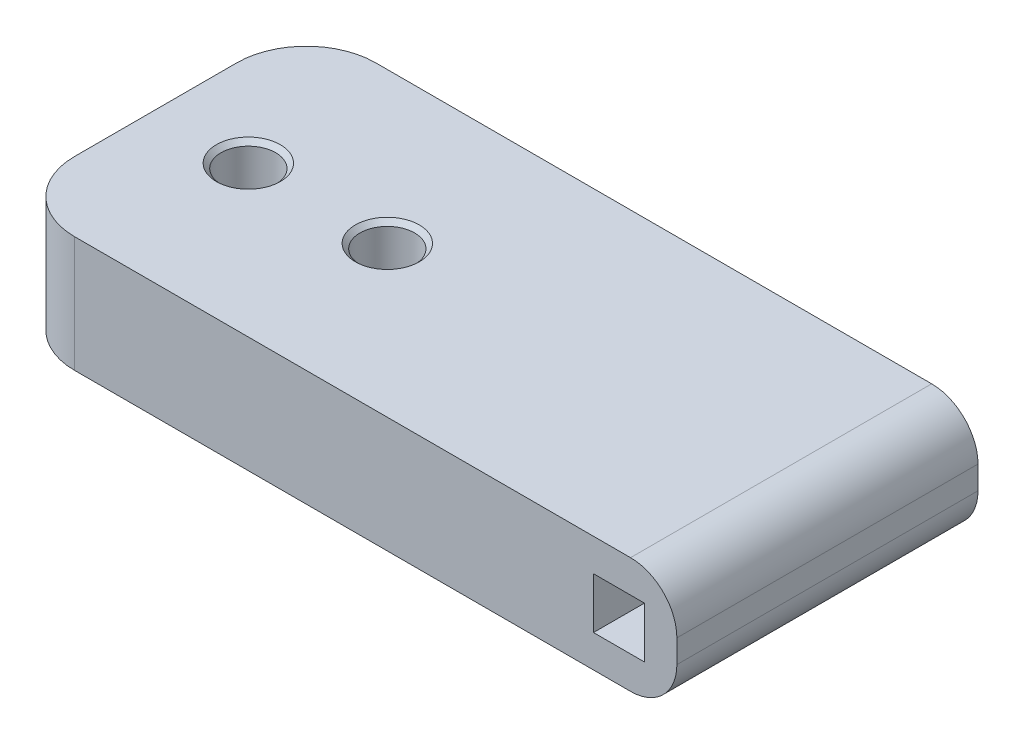
ISO-10303-21;
HEADER;
FILE_DESCRIPTION(('STEP AP214'),'2;1');
FILE_NAME('part.step','',(''),(''),'','','');
FILE_SCHEMA(('AUTOMOTIVE_DESIGN { 1 0 10303 214 1 1 1 1 }'));
ENDSEC;
DATA;
#1=APPLICATION_CONTEXT('core data for automotive mechanical design processes');
#2=APPLICATION_PROTOCOL_DEFINITION('international standard','automotive_design',2000,#1);
#3=PRODUCT_CONTEXT('',#1,'mechanical');
#4=PRODUCT('Part','Part','',(#3));
#5=PRODUCT_RELATED_PRODUCT_CATEGORY('part','',(#4));
#6=PRODUCT_DEFINITION_FORMATION('','',#4);
#7=PRODUCT_DEFINITION_CONTEXT('part definition',#1,'design');
#8=PRODUCT_DEFINITION('design','',#6,#7);
#9=PRODUCT_DEFINITION_SHAPE('','',#8);
#10=(LENGTH_UNIT() NAMED_UNIT(*) SI_UNIT(.MILLI.,.METRE.));
#11=(NAMED_UNIT(*) PLANE_ANGLE_UNIT() SI_UNIT($,.RADIAN.));
#12=(NAMED_UNIT(*) SI_UNIT($,.STERADIAN.) SOLID_ANGLE_UNIT());
#13=UNCERTAINTY_MEASURE_WITH_UNIT(LENGTH_MEASURE(1.E-05),#10,'distance_accuracy_value','');
#14=(GEOMETRIC_REPRESENTATION_CONTEXT(3) GLOBAL_UNCERTAINTY_ASSIGNED_CONTEXT((#13)) GLOBAL_UNIT_ASSIGNED_CONTEXT((#10,
#11,#12)) REPRESENTATION_CONTEXT('',''));
#15=CARTESIAN_POINT('',(0.,0.,0.));
#16=DIRECTION('',(0.,0.,1.));
#17=DIRECTION('',(1.,0.,0.));
#18=AXIS2_PLACEMENT_3D('',#15,#16,#17);
#19=CARTESIAN_POINT('',(0.,6.35,0.));
#20=DIRECTION('',(1.,0.,0.));
#21=DIRECTION('',(0.,0.,-1.));
#22=AXIS2_PLACEMENT_3D('',#19,#20,#21);
#23=PLANE('',#22);
#24=DIRECTION('',(0.,0.,1.));
#25=VECTOR('',#24,1.);
#26=CARTESIAN_POINT('',(0.,0.,0.));
#27=LINE('',#26,#25);
#28=CARTESIAN_POINT('',(0.,0.,-12.7));
#29=VERTEX_POINT('',#28);
#30=CARTESIAN_POINT('',(0.,0.,-3.81));
#31=VERTEX_POINT('',#30);
#32=EDGE_CURVE('E218',#29,#31,#27,.T.);
#33=ORIENTED_EDGE('',*,*,#32,.T.);
#34=DIRECTION('',(0.,-1.,0.));
#35=VECTOR('',#34,1.);
#36=CARTESIAN_POINT('',(0.,6.35,-3.81));
#37=LINE('',#36,#35);
#38=CARTESIAN_POINT('',(0.,6.35,-3.81));
#39=VERTEX_POINT('',#38);
#40=EDGE_CURVE('E279',#31,#39,#37,.F.);
#41=ORIENTED_EDGE('',*,*,#40,.T.);
#42=DIRECTION('',(0.,0.,1.));
#43=VECTOR('',#42,1.);
#44=CARTESIAN_POINT('',(0.,6.35,0.));
#45=LINE('',#44,#43);
#46=CARTESIAN_POINT('',(0.,6.35,-12.7));
#47=VERTEX_POINT('',#46);
#48=EDGE_CURVE('E225',#47,#39,#45,.T.);
#49=ORIENTED_EDGE('',*,*,#48,.F.);
#50=DIRECTION('',(0.,-1.,0.));
#51=VECTOR('',#50,1.);
#52=CARTESIAN_POINT('',(0.,6.35,-12.7));
#53=LINE('',#52,#51);
#54=EDGE_CURVE('E276',#47,#29,#53,.T.);
#55=ORIENTED_EDGE('',*,*,#54,.T.);
#56=EDGE_LOOP('',(#33,#41,#49,#55));
#57=FACE_BOUND('',#56,.T.);
#58=ADVANCED_FACE('F33',(#57),#23,.F.);
#59=CARTESIAN_POINT('',(0.,6.35,0.));
#60=DIRECTION('',(0.,0.,-1.));
#61=DIRECTION('',(-1.,0.,0.));
#62=AXIS2_PLACEMENT_3D('',#59,#60,#61);
#63=PLANE('',#62);
#64=DIRECTION('',(1.,0.,0.));
#65=VECTOR('',#64,1.);
#66=CARTESIAN_POINT('',(32.258,1.778,0.));
#67=LINE('',#66,#65);
#68=CARTESIAN_POINT('',(32.258,1.778,0.));
#69=VERTEX_POINT('',#68);
#70=CARTESIAN_POINT('',(35.052,1.778,0.));
#71=VERTEX_POINT('',#70);
#72=EDGE_CURVE('E208',#69,#71,#67,.T.);
#73=ORIENTED_EDGE('',*,*,#72,.F.);
#74=DIRECTION('',(0.,-1.,0.));
#75=VECTOR('',#74,1.);
#76=CARTESIAN_POINT('',(32.258,4.572,0.));
#77=LINE('',#76,#75);
#78=CARTESIAN_POINT('',(32.258,4.572,0.));
#79=VERTEX_POINT('',#78);
#80=EDGE_CURVE('E189',#79,#69,#77,.T.);
#81=ORIENTED_EDGE('',*,*,#80,.F.);
#82=DIRECTION('',(-1.,0.,0.));
#83=VECTOR('',#82,1.);
#84=CARTESIAN_POINT('',(32.258,4.572,0.));
#85=LINE('',#84,#83);
#86=CARTESIAN_POINT('',(35.052,4.572,0.));
#87=VERTEX_POINT('',#86);
#88=EDGE_CURVE('E197',#87,#79,#85,.T.);
#89=ORIENTED_EDGE('',*,*,#88,.F.);
#90=DIRECTION('',(0.,1.,0.));
#91=VECTOR('',#90,1.);
#92=CARTESIAN_POINT('',(35.052,4.572,0.));
#93=LINE('',#92,#91);
#94=EDGE_CURVE('E211',#71,#87,#93,.T.);
#95=ORIENTED_EDGE('',*,*,#94,.F.);
#96=EDGE_LOOP('',(#73,#81,#89,#95));
#97=FACE_BOUND('',#96,.T.);
#98=DIRECTION('',(1.,0.,0.));
#99=VECTOR('',#98,1.);
#100=CARTESIAN_POINT('',(0.,0.,0.));
#101=LINE('',#100,#99);
#102=CARTESIAN_POINT('',(3.81,0.,0.));
#103=VERTEX_POINT('',#102);
#104=CARTESIAN_POINT('',(34.29,0.,0.));
#105=VERTEX_POINT('',#104);
#106=EDGE_CURVE('E236',#103,#105,#101,.T.);
#107=ORIENTED_EDGE('',*,*,#106,.T.);
#108=CARTESIAN_POINT('',(34.29,2.54,0.));
#109=DIRECTION('',(0.,0.,-1.));
#110=DIRECTION('',(-1.,0.,0.));
#111=AXIS2_PLACEMENT_3D('',#108,#109,#110);
#112=CIRCLE('',#111,2.54);
#113=CARTESIAN_POINT('',(36.83,2.54,0.));
#114=VERTEX_POINT('',#113);
#115=EDGE_CURVE('E41',#105,#114,#112,.F.);
#116=ORIENTED_EDGE('',*,*,#115,.T.);
#117=DIRECTION('',(0.,-1.,0.));
#118=VECTOR('',#117,1.);
#119=CARTESIAN_POINT('',(36.83,6.35,0.));
#120=LINE('',#119,#118);
#121=CARTESIAN_POINT('',(36.83,3.81,0.));
#122=VERTEX_POINT('',#121);
#123=EDGE_CURVE('E241',#122,#114,#120,.T.);
#124=ORIENTED_EDGE('',*,*,#123,.F.);
#125=CARTESIAN_POINT('',(34.29,3.81,0.));
#126=DIRECTION('',(0.,0.,-1.));
#127=DIRECTION('',(-1.,0.,0.));
#128=AXIS2_PLACEMENT_3D('',#125,#126,#127);
#129=CIRCLE('',#128,2.54);
#130=CARTESIAN_POINT('',(34.29,6.35,0.));
#131=VERTEX_POINT('',#130);
#132=EDGE_CURVE('E48',#122,#131,#129,.F.);
#133=ORIENTED_EDGE('',*,*,#132,.T.);
#134=DIRECTION('',(1.,0.,0.));
#135=VECTOR('',#134,1.);
#136=CARTESIAN_POINT('',(0.,6.35,0.));
#137=LINE('',#136,#135);
#138=CARTESIAN_POINT('',(3.81,6.35,0.));
#139=VERTEX_POINT('',#138);
#140=EDGE_CURVE('E228',#139,#131,#137,.T.);
#141=ORIENTED_EDGE('',*,*,#140,.F.);
#142=DIRECTION('',(0.,-1.,0.));
#143=VECTOR('',#142,1.);
#144=CARTESIAN_POINT('',(3.81,6.35,0.));
#145=LINE('',#144,#143);
#146=EDGE_CURVE('E268',#139,#103,#145,.T.);
#147=ORIENTED_EDGE('',*,*,#146,.T.);
#148=EDGE_LOOP('',(#107,#116,#124,#133,#141,#147));
#149=FACE_BOUND('',#148,.T.);
#150=ADVANCED_FACE('F299',(#97,#149),#63,.F.);
#151=CARTESIAN_POINT('',(36.83,6.35,0.));
#152=DIRECTION('',(-1.,0.,0.));
#153=DIRECTION('',(0.,0.,1.));
#154=AXIS2_PLACEMENT_3D('',#151,#152,#153);
#155=PLANE('',#154);
#156=ORIENTED_EDGE('',*,*,#123,.T.);
#157=DIRECTION('',(0.,0.,-1.));
#158=VECTOR('',#157,1.);
#159=CARTESIAN_POINT('',(36.83,2.54,-16.51));
#160=LINE('',#159,#158);
#161=CARTESIAN_POINT('',(36.83,2.54,-16.51));
#162=VERTEX_POINT('',#161);
#163=EDGE_CURVE('E290',#114,#162,#160,.T.);
#164=ORIENTED_EDGE('',*,*,#163,.T.);
#165=DIRECTION('',(0.,-1.,0.));
#166=VECTOR('',#165,1.);
#167=CARTESIAN_POINT('',(36.83,6.35,-16.51));
#168=LINE('',#167,#166);
#169=CARTESIAN_POINT('',(36.83,3.81,-16.51));
#170=VERTEX_POINT('',#169);
#171=EDGE_CURVE('E233',#170,#162,#168,.T.);
#172=ORIENTED_EDGE('',*,*,#171,.F.);
#173=DIRECTION('',(0.,0.,-1.));
#174=VECTOR('',#173,1.);
#175=CARTESIAN_POINT('',(36.83,3.81,0.));
#176=LINE('',#175,#174);
#177=EDGE_CURVE('E288',#170,#122,#176,.F.);
#178=ORIENTED_EDGE('',*,*,#177,.T.);
#179=EDGE_LOOP('',(#156,#164,#172,#178));
#180=FACE_BOUND('',#179,.T.);
#181=ADVANCED_FACE('F303',(#180),#155,.F.);
#182=CARTESIAN_POINT('',(0.,6.35,-16.51));
#183=DIRECTION('',(0.,0.,1.));
#184=DIRECTION('',(1.,0.,0.));
#185=AXIS2_PLACEMENT_3D('',#182,#183,#184);
#186=PLANE('',#185);
#187=DIRECTION('',(-1.,0.,0.));
#188=VECTOR('',#187,1.);
#189=CARTESIAN_POINT('',(35.052,1.778,-16.51));
#190=LINE('',#189,#188);
#191=CARTESIAN_POINT('',(35.052,1.778,-16.51));
#192=VERTEX_POINT('',#191);
#193=CARTESIAN_POINT('',(32.258,1.778,-16.51));
#194=VERTEX_POINT('',#193);
#195=EDGE_CURVE('E183',#192,#194,#190,.T.);
#196=ORIENTED_EDGE('',*,*,#195,.F.);
#197=DIRECTION('',(0.,-1.,0.));
#198=VECTOR('',#197,1.);
#199=CARTESIAN_POINT('',(35.052,1.778,-16.51));
#200=LINE('',#199,#198);
#201=CARTESIAN_POINT('',(35.052,4.572,-16.51));
#202=VERTEX_POINT('',#201);
#203=EDGE_CURVE('E157',#202,#192,#200,.T.);
#204=ORIENTED_EDGE('',*,*,#203,.F.);
#205=DIRECTION('',(1.,0.,0.));
#206=VECTOR('',#205,1.);
#207=CARTESIAN_POINT('',(35.052,4.572,-16.51));
#208=LINE('',#207,#206);
#209=CARTESIAN_POINT('',(32.258,4.572,-16.51));
#210=VERTEX_POINT('',#209);
#211=EDGE_CURVE('E174',#210,#202,#208,.T.);
#212=ORIENTED_EDGE('',*,*,#211,.F.);
#213=DIRECTION('',(0.,1.,0.));
#214=VECTOR('',#213,1.);
#215=CARTESIAN_POINT('',(32.258,1.778,-16.51));
#216=LINE('',#215,#214);
#217=EDGE_CURVE('E177',#194,#210,#216,.T.);
#218=ORIENTED_EDGE('',*,*,#217,.F.);
#219=EDGE_LOOP('',(#196,#204,#212,#218));
#220=FACE_BOUND('',#219,.T.);
#221=ORIENTED_EDGE('',*,*,#171,.T.);
#222=CARTESIAN_POINT('',(34.29,2.54,-16.51));
#223=DIRECTION('',(0.,0.,1.));
#224=DIRECTION('',(1.,0.,0.));
#225=AXIS2_PLACEMENT_3D('',#222,#223,#224);
#226=CIRCLE('',#225,2.54);
#227=CARTESIAN_POINT('',(34.29,0.,-16.51));
#228=VERTEX_POINT('',#227);
#229=EDGE_CURVE('E295',#162,#228,#226,.F.);
#230=ORIENTED_EDGE('',*,*,#229,.T.);
#231=DIRECTION('',(-1.,0.,0.));
#232=VECTOR('',#231,1.);
#233=CARTESIAN_POINT('',(0.,0.,-16.51));
#234=LINE('',#233,#232);
#235=CARTESIAN_POINT('',(3.81,0.,-16.51));
#236=VERTEX_POINT('',#235);
#237=EDGE_CURVE('E229',#228,#236,#234,.T.);
#238=ORIENTED_EDGE('',*,*,#237,.T.);
#239=DIRECTION('',(0.,-1.,0.));
#240=VECTOR('',#239,1.);
#241=CARTESIAN_POINT('',(3.81,6.35,-16.51));
#242=LINE('',#241,#240);
#243=CARTESIAN_POINT('',(3.81,6.35,-16.51));
#244=VERTEX_POINT('',#243);
#245=EDGE_CURVE('E285',#236,#244,#242,.F.);
#246=ORIENTED_EDGE('',*,*,#245,.T.);
#247=DIRECTION('',(-1.,0.,0.));
#248=VECTOR('',#247,1.);
#249=CARTESIAN_POINT('',(0.,6.35,-16.51));
#250=LINE('',#249,#248);
#251=CARTESIAN_POINT('',(34.29,6.35,-16.51));
#252=VERTEX_POINT('',#251);
#253=EDGE_CURVE('E231',#252,#244,#250,.T.);
#254=ORIENTED_EDGE('',*,*,#253,.F.);
#255=CARTESIAN_POINT('',(34.29,3.81,-16.51));
#256=DIRECTION('',(0.,0.,1.));
#257=DIRECTION('',(1.,0.,0.));
#258=AXIS2_PLACEMENT_3D('',#255,#256,#257);
#259=CIRCLE('',#258,2.54);
#260=EDGE_CURVE('E293',#252,#170,#259,.F.);
#261=ORIENTED_EDGE('',*,*,#260,.T.);
#262=EDGE_LOOP('',(#221,#230,#238,#246,#254,#261));
#263=FACE_BOUND('',#262,.T.);
#264=ADVANCED_FACE('F308',(#220,#263),#186,.F.);
#265=CARTESIAN_POINT('',(0.,6.35,0.));
#266=DIRECTION('',(0.,-1.,0.));
#267=DIRECTION('',(0.,0.,-1.));
#268=AXIS2_PLACEMENT_3D('',#265,#266,#267);
#269=PLANE('',#268);
#270=CARTESIAN_POINT('',(12.7,6.35,-8.255));
#271=DIRECTION('',(0.,-1.,0.));
#272=DIRECTION('',(0.,0.,-1.));
#273=AXIS2_PLACEMENT_3D('',#270,#271,#272);
#274=CIRCLE('',#273,1.754);
#275=CARTESIAN_POINT('',(12.7,6.35,-10.009));
#276=VERTEX_POINT('',#275);
#277=EDGE_CURVE('E265',#276,#276,#274,.T.);
#278=ORIENTED_EDGE('',*,*,#277,.T.);
#279=EDGE_LOOP('',(#278));
#280=FACE_BOUND('',#279,.T.);
#281=CARTESIAN_POINT('',(5.08,6.35,-8.255));
#282=DIRECTION('',(0.,-1.,0.));
#283=DIRECTION('',(0.,0.,-1.));
#284=AXIS2_PLACEMENT_3D('',#281,#282,#283);
#285=CIRCLE('',#284,1.75399999999999);
#286=CARTESIAN_POINT('',(5.08,6.35,-10.009));
#287=VERTEX_POINT('',#286);
#288=EDGE_CURVE('E262',#287,#287,#285,.T.);
#289=ORIENTED_EDGE('',*,*,#288,.T.);
#290=EDGE_LOOP('',(#289));
#291=FACE_BOUND('',#290,.T.);
#292=ORIENTED_EDGE('',*,*,#140,.T.);
#293=DIRECTION('',(0.,0.,-1.));
#294=VECTOR('',#293,1.);
#295=CARTESIAN_POINT('',(34.29,6.35,0.));
#296=LINE('',#295,#294);
#297=EDGE_CURVE('E11',#131,#252,#296,.T.);
#298=ORIENTED_EDGE('',*,*,#297,.T.);
#299=ORIENTED_EDGE('',*,*,#253,.T.);
#300=CARTESIAN_POINT('',(3.81,6.35,-12.7));
#301=DIRECTION('',(0.,-1.,0.));
#302=DIRECTION('',(0.,0.,-1.));
#303=AXIS2_PLACEMENT_3D('',#300,#301,#302);
#304=CIRCLE('',#303,3.81);
#305=EDGE_CURVE('E281',#244,#47,#304,.F.);
#306=ORIENTED_EDGE('',*,*,#305,.T.);
#307=ORIENTED_EDGE('',*,*,#48,.T.);
#308=CARTESIAN_POINT('',(3.81,6.35,-3.81));
#309=DIRECTION('',(0.,-1.,0.));
#310=DIRECTION('',(0.,0.,-1.));
#311=AXIS2_PLACEMENT_3D('',#308,#309,#310);
#312=CIRCLE('',#311,3.81);
#313=EDGE_CURVE('E283',#39,#139,#312,.F.);
#314=ORIENTED_EDGE('',*,*,#313,.T.);
#315=EDGE_LOOP('',(#292,#298,#299,#306,#307,#314));
#316=FACE_BOUND('',#315,.T.);
#317=ADVANCED_FACE('F318',(#280,#291,#316),#269,.F.);
#318=CARTESIAN_POINT('',(0.,0.,0.));
#319=DIRECTION('',(0.,-1.,0.));
#320=DIRECTION('',(0.,0.,-1.));
#321=AXIS2_PLACEMENT_3D('',#318,#319,#320);
#322=PLANE('',#321);
#323=CARTESIAN_POINT('',(5.08,0.,-8.255));
#324=DIRECTION('',(0.,-1.,0.));
#325=DIRECTION('',(0.,0.,-1.));
#326=AXIS2_PLACEMENT_3D('',#323,#324,#325);
#327=CIRCLE('',#326,1.754);
#328=CARTESIAN_POINT('',(5.08,0.,-10.009));
#329=VERTEX_POINT('',#328);
#330=EDGE_CURVE('E247',#329,#329,#327,.F.);
#331=ORIENTED_EDGE('',*,*,#330,.T.);
#332=EDGE_LOOP('',(#331));
#333=FACE_BOUND('',#332,.T.);
#334=CARTESIAN_POINT('',(12.7,0.,-8.255));
#335=DIRECTION('',(0.,-1.,0.));
#336=DIRECTION('',(0.,0.,-1.));
#337=AXIS2_PLACEMENT_3D('',#334,#335,#336);
#338=CIRCLE('',#337,1.754);
#339=CARTESIAN_POINT('',(12.7,0.,-10.009));
#340=VERTEX_POINT('',#339);
#341=EDGE_CURVE('E244',#340,#340,#338,.F.);
#342=ORIENTED_EDGE('',*,*,#341,.T.);
#343=EDGE_LOOP('',(#342));
#344=FACE_BOUND('',#343,.T.);
#345=ORIENTED_EDGE('',*,*,#237,.F.);
#346=DIRECTION('',(0.,0.,-1.));
#347=VECTOR('',#346,1.);
#348=CARTESIAN_POINT('',(34.29,0.,0.));
#349=LINE('',#348,#347);
#350=EDGE_CURVE('E56',#228,#105,#349,.F.);
#351=ORIENTED_EDGE('',*,*,#350,.T.);
#352=ORIENTED_EDGE('',*,*,#106,.F.);
#353=CARTESIAN_POINT('',(3.81,0.,-3.81));
#354=DIRECTION('',(0.,-1.,0.));
#355=DIRECTION('',(0.,0.,-1.));
#356=AXIS2_PLACEMENT_3D('',#353,#354,#355);
#357=CIRCLE('',#356,3.81);
#358=EDGE_CURVE('E274',#103,#31,#357,.T.);
#359=ORIENTED_EDGE('',*,*,#358,.T.);
#360=ORIENTED_EDGE('',*,*,#32,.F.);
#361=CARTESIAN_POINT('',(3.81,0.,-12.7));
#362=DIRECTION('',(0.,-1.,0.));
#363=DIRECTION('',(0.,0.,-1.));
#364=AXIS2_PLACEMENT_3D('',#361,#362,#363);
#365=CIRCLE('',#364,3.81);
#366=EDGE_CURVE('E271',#29,#236,#365,.T.);
#367=ORIENTED_EDGE('',*,*,#366,.T.);
#368=EDGE_LOOP('',(#345,#351,#352,#359,#360,#367));
#369=FACE_BOUND('',#368,.T.);
#370=ADVANCED_FACE('F309',(#333,#344,#369),#322,.T.);
#371=CARTESIAN_POINT('',(12.7,6.35,-8.255));
#372=DIRECTION('',(0.,1.,0.));
#373=DIRECTION('',(0.,0.,1.));
#374=AXIS2_PLACEMENT_3D('',#371,#372,#373);
#375=CYLINDRICAL_SURFACE('',#374,1.49999999999999);
#376=CARTESIAN_POINT('',(12.7,0.254000000000004,-8.255));
#377=DIRECTION('',(0.,-1.,0.));
#378=DIRECTION('',(0.,0.,-1.));
#379=AXIS2_PLACEMENT_3D('',#376,#377,#378);
#380=CIRCLE('',#379,1.49999999999999);
#381=CARTESIAN_POINT('',(12.7,0.254000000000004,-9.75499999999999));
#382=VERTEX_POINT('',#381);
#383=EDGE_CURVE('E259',#382,#382,#380,.T.);
#384=ORIENTED_EDGE('',*,*,#383,.T.);
#385=EDGE_LOOP('',(#384));
#386=FACE_BOUND('',#385,.T.);
#387=CARTESIAN_POINT('',(12.7,6.096,-8.255));
#388=DIRECTION('',(0.,-1.,0.));
#389=DIRECTION('',(0.,0.,-1.));
#390=AXIS2_PLACEMENT_3D('',#387,#388,#389);
#391=CIRCLE('',#390,1.49999999999999);
#392=CARTESIAN_POINT('',(12.7,6.096,-9.75499999999999));
#393=VERTEX_POINT('',#392);
#394=EDGE_CURVE('E256',#393,#393,#391,.F.);
#395=ORIENTED_EDGE('',*,*,#394,.T.);
#396=EDGE_LOOP('',(#395));
#397=FACE_BOUND('',#396,.T.);
#398=ADVANCED_FACE('F377',(#386,#397),#375,.F.);
#399=CARTESIAN_POINT('',(5.08,6.35,-8.255));
#400=DIRECTION('',(0.,1.,0.));
#401=DIRECTION('',(0.,0.,1.));
#402=AXIS2_PLACEMENT_3D('',#399,#400,#401);
#403=CYLINDRICAL_SURFACE('',#402,1.49999999999999);
#404=CARTESIAN_POINT('',(5.08,0.254000000000004,-8.255));
#405=DIRECTION('',(0.,-1.,0.));
#406=DIRECTION('',(0.,0.,-1.));
#407=AXIS2_PLACEMENT_3D('',#404,#405,#406);
#408=CIRCLE('',#407,1.49999999999999);
#409=CARTESIAN_POINT('',(5.08,0.254000000000004,-9.75499999999999));
#410=VERTEX_POINT('',#409);
#411=EDGE_CURVE('E253',#410,#410,#408,.T.);
#412=ORIENTED_EDGE('',*,*,#411,.T.);
#413=EDGE_LOOP('',(#412));
#414=FACE_BOUND('',#413,.T.);
#415=CARTESIAN_POINT('',(5.08,6.096,-8.255));
#416=DIRECTION('',(0.,-1.,0.));
#417=DIRECTION('',(0.,0.,-1.));
#418=AXIS2_PLACEMENT_3D('',#415,#416,#417);
#419=CIRCLE('',#418,1.49999999999999);
#420=CARTESIAN_POINT('',(5.08,6.096,-9.75499999999999));
#421=VERTEX_POINT('',#420);
#422=EDGE_CURVE('E250',#421,#421,#419,.F.);
#423=ORIENTED_EDGE('',*,*,#422,.T.);
#424=EDGE_LOOP('',(#423));
#425=FACE_BOUND('',#424,.T.);
#426=ADVANCED_FACE('F340',(#414,#425),#403,.F.);
#427=CARTESIAN_POINT('',(5.08,0.,-8.255));
#428=DIRECTION('',(0.,-1.,0.));
#429=DIRECTION('',(0.,0.,-1.));
#430=AXIS2_PLACEMENT_3D('',#427,#428,#429);
#431=CONICAL_SURFACE('',#430,1.754,0.785398163397444);
#432=ORIENTED_EDGE('',*,*,#411,.F.);
#433=EDGE_LOOP('',(#432));
#434=FACE_BOUND('',#433,.T.);
#435=ORIENTED_EDGE('',*,*,#330,.F.);
#436=EDGE_LOOP('',(#435));
#437=FACE_BOUND('',#436,.T.);
#438=ADVANCED_FACE('F336',(#434,#437),#431,.F.);
#439=CARTESIAN_POINT('',(12.7,0.,-8.255));
#440=DIRECTION('',(0.,-1.,0.));
#441=DIRECTION('',(0.,0.,-1.));
#442=AXIS2_PLACEMENT_3D('',#439,#440,#441);
#443=CONICAL_SURFACE('',#442,1.754,0.785398163397445);
#444=ORIENTED_EDGE('',*,*,#383,.F.);
#445=EDGE_LOOP('',(#444));
#446=FACE_BOUND('',#445,.T.);
#447=ORIENTED_EDGE('',*,*,#341,.F.);
#448=EDGE_LOOP('',(#447));
#449=FACE_BOUND('',#448,.T.);
#450=ADVANCED_FACE('F339',(#446,#449),#443,.F.);
#451=CARTESIAN_POINT('',(12.7,6.096,-8.255));
#452=DIRECTION('',(0.,1.,0.));
#453=DIRECTION('',(0.,0.,1.));
#454=AXIS2_PLACEMENT_3D('',#451,#452,#453);
#455=CONICAL_SURFACE('',#454,1.49999999999999,0.785398163397452);
#456=ORIENTED_EDGE('',*,*,#277,.F.);
#457=EDGE_LOOP('',(#456));
#458=FACE_BOUND('',#457,.T.);
#459=ORIENTED_EDGE('',*,*,#394,.F.);
#460=EDGE_LOOP('',(#459));
#461=FACE_BOUND('',#460,.T.);
#462=ADVANCED_FACE('F344',(#458,#461),#455,.F.);
#463=CARTESIAN_POINT('',(5.08,6.096,-8.255));
#464=DIRECTION('',(0.,1.,0.));
#465=DIRECTION('',(0.,0.,1.));
#466=AXIS2_PLACEMENT_3D('',#463,#464,#465);
#467=CONICAL_SURFACE('',#466,1.49999999999999,0.785398163397451);
#468=ORIENTED_EDGE('',*,*,#288,.F.);
#469=EDGE_LOOP('',(#468));
#470=FACE_BOUND('',#469,.T.);
#471=ORIENTED_EDGE('',*,*,#422,.F.);
#472=EDGE_LOOP('',(#471));
#473=FACE_BOUND('',#472,.T.);
#474=ADVANCED_FACE('F348',(#470,#473),#467,.F.);
#475=CARTESIAN_POINT('',(3.81,6.35,-3.81));
#476=DIRECTION('',(0.,-1.,0.));
#477=DIRECTION('',(0.,0.,-1.));
#478=AXIS2_PLACEMENT_3D('',#475,#476,#477);
#479=CYLINDRICAL_SURFACE('',#478,3.81);
#480=ORIENTED_EDGE('',*,*,#313,.F.);
#481=ORIENTED_EDGE('',*,*,#40,.F.);
#482=ORIENTED_EDGE('',*,*,#358,.F.);
#483=ORIENTED_EDGE('',*,*,#146,.F.);
#484=EDGE_LOOP('',(#480,#481,#482,#483));
#485=FACE_BOUND('',#484,.T.);
#486=ADVANCED_FACE('F352',(#485),#479,.T.);
#487=CARTESIAN_POINT('',(3.81,6.35,-12.7));
#488=DIRECTION('',(0.,-1.,0.));
#489=DIRECTION('',(0.,0.,-1.));
#490=AXIS2_PLACEMENT_3D('',#487,#488,#489);
#491=CYLINDRICAL_SURFACE('',#490,3.81);
#492=ORIENTED_EDGE('',*,*,#305,.F.);
#493=ORIENTED_EDGE('',*,*,#245,.F.);
#494=ORIENTED_EDGE('',*,*,#366,.F.);
#495=ORIENTED_EDGE('',*,*,#54,.F.);
#496=EDGE_LOOP('',(#492,#493,#494,#495));
#497=FACE_BOUND('',#496,.T.);
#498=ADVANCED_FACE('F315',(#497),#491,.T.);
#499=CARTESIAN_POINT('',(32.258,4.572,-5.08));
#500=DIRECTION('',(-1.,0.,0.));
#501=DIRECTION('',(0.,0.,1.));
#502=AXIS2_PLACEMENT_3D('',#499,#500,#501);
#503=PLANE('',#502);
#504=ORIENTED_EDGE('',*,*,#80,.T.);
#505=DIRECTION('',(0.,0.,1.));
#506=VECTOR('',#505,1.);
#507=CARTESIAN_POINT('',(32.258,1.778,-5.08));
#508=LINE('',#507,#506);
#509=CARTESIAN_POINT('',(32.258,1.778,-5.08));
#510=VERTEX_POINT('',#509);
#511=EDGE_CURVE('E206',#510,#69,#508,.T.);
#512=ORIENTED_EDGE('',*,*,#511,.F.);
#513=DIRECTION('',(0.,-1.,0.));
#514=VECTOR('',#513,1.);
#515=CARTESIAN_POINT('',(32.258,4.572,-5.08));
#516=LINE('',#515,#514);
#517=CARTESIAN_POINT('',(32.258,4.572,-5.08));
#518=VERTEX_POINT('',#517);
#519=EDGE_CURVE('E193',#518,#510,#516,.T.);
#520=ORIENTED_EDGE('',*,*,#519,.F.);
#521=DIRECTION('',(0.,0.,1.));
#522=VECTOR('',#521,1.);
#523=CARTESIAN_POINT('',(32.258,4.572,-5.08));
#524=LINE('',#523,#522);
#525=EDGE_CURVE('E216',#518,#79,#524,.T.);
#526=ORIENTED_EDGE('',*,*,#525,.T.);
#527=EDGE_LOOP('',(#504,#512,#520,#526));
#528=FACE_BOUND('',#527,.T.);
#529=ADVANCED_FACE('F358',(#528),#503,.F.);
#530=CARTESIAN_POINT('',(32.258,4.572,-5.08));
#531=DIRECTION('',(0.,1.,0.));
#532=DIRECTION('',(-1.,0.,0.));
#533=AXIS2_PLACEMENT_3D('',#530,#531,#532);
#534=PLANE('',#533);
#535=ORIENTED_EDGE('',*,*,#88,.T.);
#536=ORIENTED_EDGE('',*,*,#525,.F.);
#537=DIRECTION('',(-1.,0.,0.));
#538=VECTOR('',#537,1.);
#539=CARTESIAN_POINT('',(32.258,4.572,-5.08));
#540=LINE('',#539,#538);
#541=CARTESIAN_POINT('',(35.052,4.572,-5.08));
#542=VERTEX_POINT('',#541);
#543=EDGE_CURVE('E203',#542,#518,#540,.T.);
#544=ORIENTED_EDGE('',*,*,#543,.F.);
#545=DIRECTION('',(0.,0.,1.));
#546=VECTOR('',#545,1.);
#547=CARTESIAN_POINT('',(35.052,4.572,-5.08));
#548=LINE('',#547,#546);
#549=EDGE_CURVE('E219',#542,#87,#548,.T.);
#550=ORIENTED_EDGE('',*,*,#549,.T.);
#551=EDGE_LOOP('',(#535,#536,#544,#550));
#552=FACE_BOUND('',#551,.T.);
#553=ADVANCED_FACE('F362',(#552),#534,.F.);
#554=CARTESIAN_POINT('',(35.052,4.572,-5.08));
#555=DIRECTION('',(1.,0.,0.));
#556=DIRECTION('',(0.,0.,-1.));
#557=AXIS2_PLACEMENT_3D('',#554,#555,#556);
#558=PLANE('',#557);
#559=ORIENTED_EDGE('',*,*,#94,.T.);
#560=ORIENTED_EDGE('',*,*,#549,.F.);
#561=DIRECTION('',(0.,1.,0.));
#562=VECTOR('',#561,1.);
#563=CARTESIAN_POINT('',(35.052,4.572,-5.08));
#564=LINE('',#563,#562);
#565=CARTESIAN_POINT('',(35.052,1.778,-5.08));
#566=VERTEX_POINT('',#565);
#567=EDGE_CURVE('E200',#566,#542,#564,.T.);
#568=ORIENTED_EDGE('',*,*,#567,.F.);
#569=DIRECTION('',(0.,0.,1.));
#570=VECTOR('',#569,1.);
#571=CARTESIAN_POINT('',(35.052,1.778,-5.08));
#572=LINE('',#571,#570);
#573=EDGE_CURVE('E221',#566,#71,#572,.T.);
#574=ORIENTED_EDGE('',*,*,#573,.T.);
#575=EDGE_LOOP('',(#559,#560,#568,#574));
#576=FACE_BOUND('',#575,.T.);
#577=ADVANCED_FACE('F368',(#576),#558,.F.);
#578=CARTESIAN_POINT('',(32.258,1.778,-5.08));
#579=DIRECTION('',(0.,-1.,0.));
#580=DIRECTION('',(0.,0.,-1.));
#581=AXIS2_PLACEMENT_3D('',#578,#579,#580);
#582=PLANE('',#581);
#583=ORIENTED_EDGE('',*,*,#72,.T.);
#584=ORIENTED_EDGE('',*,*,#573,.F.);
#585=DIRECTION('',(1.,0.,0.));
#586=VECTOR('',#585,1.);
#587=CARTESIAN_POINT('',(32.258,1.778,-5.08));
#588=LINE('',#587,#586);
#589=EDGE_CURVE('E196',#510,#566,#588,.T.);
#590=ORIENTED_EDGE('',*,*,#589,.F.);
#591=ORIENTED_EDGE('',*,*,#511,.T.);
#592=EDGE_LOOP('',(#583,#584,#590,#591));
#593=FACE_BOUND('',#592,.T.);
#594=ADVANCED_FACE('F373',(#593),#582,.F.);
#595=CARTESIAN_POINT('',(0.,0.,-5.08));
#596=DIRECTION('',(0.,0.,1.));
#597=DIRECTION('',(1.,0.,0.));
#598=AXIS2_PLACEMENT_3D('',#595,#596,#597);
#599=PLANE('',#598);
#600=ORIENTED_EDGE('',*,*,#519,.T.);
#601=ORIENTED_EDGE('',*,*,#589,.T.);
#602=ORIENTED_EDGE('',*,*,#567,.T.);
#603=ORIENTED_EDGE('',*,*,#543,.T.);
#604=EDGE_LOOP('',(#600,#601,#602,#603));
#605=FACE_BOUND('',#604,.T.);
#606=ADVANCED_FACE('F469',(#605),#599,.T.);
#607=CARTESIAN_POINT('',(35.052,1.778,-11.43));
#608=DIRECTION('',(1.,0.,0.));
#609=DIRECTION('',(0.,0.,-1.));
#610=AXIS2_PLACEMENT_3D('',#607,#608,#609);
#611=PLANE('',#610);
#612=ORIENTED_EDGE('',*,*,#203,.T.);
#613=DIRECTION('',(0.,0.,-1.));
#614=VECTOR('',#613,1.);
#615=CARTESIAN_POINT('',(35.052,1.778,-11.43));
#616=LINE('',#615,#614);
#617=CARTESIAN_POINT('',(35.052,1.778,-11.43));
#618=VERTEX_POINT('',#617);
#619=EDGE_CURVE('E150',#618,#192,#616,.T.);
#620=ORIENTED_EDGE('',*,*,#619,.F.);
#621=DIRECTION('',(0.,-1.,0.));
#622=VECTOR('',#621,1.);
#623=CARTESIAN_POINT('',(35.052,1.778,-11.43));
#624=LINE('',#623,#622);
#625=CARTESIAN_POINT('',(35.052,4.572,-11.43));
#626=VERTEX_POINT('',#625);
#627=EDGE_CURVE('E154',#626,#618,#624,.T.);
#628=ORIENTED_EDGE('',*,*,#627,.F.);
#629=DIRECTION('',(0.,0.,-1.));
#630=VECTOR('',#629,1.);
#631=CARTESIAN_POINT('',(35.052,4.572,-11.43));
#632=LINE('',#631,#630);
#633=EDGE_CURVE('E187',#626,#202,#632,.T.);
#634=ORIENTED_EDGE('',*,*,#633,.T.);
#635=EDGE_LOOP('',(#612,#620,#628,#634));
#636=FACE_BOUND('',#635,.T.);
#637=ADVANCED_FACE('F152',(#636),#611,.F.);
#638=CARTESIAN_POINT('',(35.052,4.572,-11.43));
#639=DIRECTION('',(0.,1.,0.));
#640=DIRECTION('',(0.,0.,1.));
#641=AXIS2_PLACEMENT_3D('',#638,#639,#640);
#642=PLANE('',#641);
#643=ORIENTED_EDGE('',*,*,#211,.T.);
#644=ORIENTED_EDGE('',*,*,#633,.F.);
#645=DIRECTION('',(1.,0.,0.));
#646=VECTOR('',#645,1.);
#647=CARTESIAN_POINT('',(35.052,4.572,-11.43));
#648=LINE('',#647,#646);
#649=CARTESIAN_POINT('',(32.258,4.572,-11.43));
#650=VERTEX_POINT('',#649);
#651=EDGE_CURVE('E162',#650,#626,#648,.T.);
#652=ORIENTED_EDGE('',*,*,#651,.F.);
#653=DIRECTION('',(0.,0.,-1.));
#654=VECTOR('',#653,1.);
#655=CARTESIAN_POINT('',(32.258,4.572,-11.43));
#656=LINE('',#655,#654);
#657=EDGE_CURVE('E190',#650,#210,#656,.T.);
#658=ORIENTED_EDGE('',*,*,#657,.T.);
#659=EDGE_LOOP('',(#643,#644,#652,#658));
#660=FACE_BOUND('',#659,.T.);
#661=ADVANCED_FACE('F487',(#660),#642,.F.);
#662=CARTESIAN_POINT('',(32.258,1.778,-11.43));
#663=DIRECTION('',(-1.,0.,0.));
#664=DIRECTION('',(0.,0.,1.));
#665=AXIS2_PLACEMENT_3D('',#662,#663,#664);
#666=PLANE('',#665);
#667=ORIENTED_EDGE('',*,*,#217,.T.);
#668=ORIENTED_EDGE('',*,*,#657,.F.);
#669=DIRECTION('',(0.,1.,0.));
#670=VECTOR('',#669,1.);
#671=CARTESIAN_POINT('',(32.258,1.778,-11.43));
#672=LINE('',#671,#670);
#673=CARTESIAN_POINT('',(32.258,1.778,-11.43));
#674=VERTEX_POINT('',#673);
#675=EDGE_CURVE('E170',#674,#650,#672,.T.);
#676=ORIENTED_EDGE('',*,*,#675,.F.);
#677=DIRECTION('',(0.,0.,-1.));
#678=VECTOR('',#677,1.);
#679=CARTESIAN_POINT('',(32.258,1.778,-11.43));
#680=LINE('',#679,#678);
#681=EDGE_CURVE('E161',#674,#194,#680,.T.);
#682=ORIENTED_EDGE('',*,*,#681,.T.);
#683=EDGE_LOOP('',(#667,#668,#676,#682));
#684=FACE_BOUND('',#683,.T.);
#685=ADVANCED_FACE('F496',(#684),#666,.F.);
#686=CARTESIAN_POINT('',(35.052,1.778,-11.43));
#687=DIRECTION('',(0.,-1.,0.));
#688=DIRECTION('',(0.,0.,-1.));
#689=AXIS2_PLACEMENT_3D('',#686,#687,#688);
#690=PLANE('',#689);
#691=ORIENTED_EDGE('',*,*,#195,.T.);
#692=ORIENTED_EDGE('',*,*,#681,.F.);
#693=DIRECTION('',(-1.,0.,0.));
#694=VECTOR('',#693,1.);
#695=CARTESIAN_POINT('',(35.052,1.778,-11.43));
#696=LINE('',#695,#694);
#697=EDGE_CURVE('E165',#618,#674,#696,.T.);
#698=ORIENTED_EDGE('',*,*,#697,.F.);
#699=ORIENTED_EDGE('',*,*,#619,.T.);
#700=EDGE_LOOP('',(#691,#692,#698,#699));
#701=FACE_BOUND('',#700,.T.);
#702=ADVANCED_FACE('F166',(#701),#690,.F.);
#703=CARTESIAN_POINT('',(0.,0.,-11.43));
#704=DIRECTION('',(0.,0.,1.));
#705=DIRECTION('',(1.,0.,0.));
#706=AXIS2_PLACEMENT_3D('',#703,#704,#705);
#707=PLANE('',#706);
#708=ORIENTED_EDGE('',*,*,#627,.T.);
#709=ORIENTED_EDGE('',*,*,#697,.T.);
#710=ORIENTED_EDGE('',*,*,#675,.T.);
#711=ORIENTED_EDGE('',*,*,#651,.T.);
#712=EDGE_LOOP('',(#708,#709,#710,#711));
#713=FACE_BOUND('',#712,.T.);
#714=ADVANCED_FACE('F172',(#713),#707,.F.);
#715=CARTESIAN_POINT('',(34.29,2.54,0.));
#716=DIRECTION('',(0.,0.,1.));
#717=DIRECTION('',(1.,0.,0.));
#718=AXIS2_PLACEMENT_3D('',#715,#716,#717);
#719=CYLINDRICAL_SURFACE('',#718,2.54);
#720=ORIENTED_EDGE('',*,*,#115,.F.);
#721=ORIENTED_EDGE('',*,*,#350,.F.);
#722=ORIENTED_EDGE('',*,*,#229,.F.);
#723=ORIENTED_EDGE('',*,*,#163,.F.);
#724=EDGE_LOOP('',(#720,#721,#722,#723));
#725=FACE_BOUND('',#724,.T.);
#726=ADVANCED_FACE('F306',(#725),#719,.T.);
#727=CARTESIAN_POINT('',(34.29,3.81,0.));
#728=DIRECTION('',(0.,0.,-1.));
#729=DIRECTION('',(-1.,0.,0.));
#730=AXIS2_PLACEMENT_3D('',#727,#728,#729);
#731=CYLINDRICAL_SURFACE('',#730,2.54);
#732=ORIENTED_EDGE('',*,*,#132,.F.);
#733=ORIENTED_EDGE('',*,*,#177,.F.);
#734=ORIENTED_EDGE('',*,*,#260,.F.);
#735=ORIENTED_EDGE('',*,*,#297,.F.);
#736=EDGE_LOOP('',(#732,#733,#734,#735));
#737=FACE_BOUND('',#736,.T.);
#738=ADVANCED_FACE('F35',(#737),#731,.T.);
#739=CLOSED_SHELL('',(#58,#150,#181,#264,#317,#370,#398,#426,#438,#450,#462,#474,#486,#498,#529,
#553,#577,#594,#606,#637,#661,#685,#702,#714,#726,#738));
#740=MANIFOLD_SOLID_BREP('B2',#739);
#741=ADVANCED_BREP_SHAPE_REPRESENTATION('',(#18,#740),#14);
#742=SHAPE_DEFINITION_REPRESENTATION(#9,#741);
ENDSEC;
END-ISO-10303-21;
